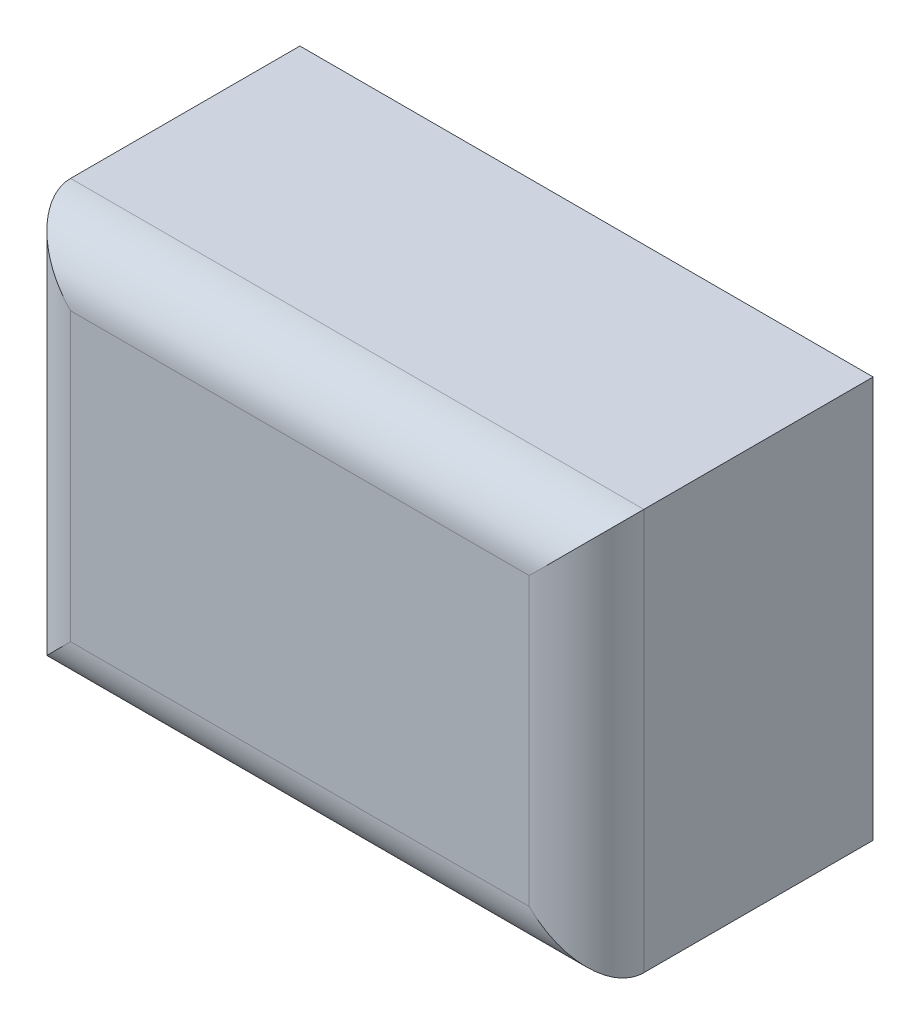
ISO-10303-21;
HEADER;
FILE_DESCRIPTION(('STEP AP214'),'2;1');
FILE_NAME('part.step','',(''),(''),'','','');
FILE_SCHEMA(('AUTOMOTIVE_DESIGN { 1 0 10303 214 1 1 1 1 }'));
ENDSEC;
DATA;
#1=APPLICATION_CONTEXT('core data for automotive mechanical design processes');
#2=APPLICATION_PROTOCOL_DEFINITION('international standard','automotive_design',2000,#1);
#3=PRODUCT_CONTEXT('',#1,'mechanical');
#4=PRODUCT('Part','Part','',(#3));
#5=PRODUCT_RELATED_PRODUCT_CATEGORY('part','',(#4));
#6=PRODUCT_DEFINITION_FORMATION('','',#4);
#7=PRODUCT_DEFINITION_CONTEXT('part definition',#1,'design');
#8=PRODUCT_DEFINITION('design','',#6,#7);
#9=PRODUCT_DEFINITION_SHAPE('','',#8);
#10=(LENGTH_UNIT() NAMED_UNIT(*) SI_UNIT(.MILLI.,.METRE.));
#11=(NAMED_UNIT(*) PLANE_ANGLE_UNIT() SI_UNIT($,.RADIAN.));
#12=(NAMED_UNIT(*) SI_UNIT($,.STERADIAN.) SOLID_ANGLE_UNIT());
#13=UNCERTAINTY_MEASURE_WITH_UNIT(LENGTH_MEASURE(1.E-05),#10,'distance_accuracy_value','');
#14=(GEOMETRIC_REPRESENTATION_CONTEXT(3) GLOBAL_UNCERTAINTY_ASSIGNED_CONTEXT((#13)) GLOBAL_UNIT_ASSIGNED_CONTEXT((#10,
#11,#12)) REPRESENTATION_CONTEXT('',''));
#15=CARTESIAN_POINT('',(0.,0.,0.));
#16=DIRECTION('',(0.,0.,1.));
#17=DIRECTION('',(1.,0.,0.));
#18=AXIS2_PLACEMENT_3D('',#15,#16,#17);
#19=CARTESIAN_POINT('',(0.,0.125,0.2));
#20=DIRECTION('',(1.,0.,0.));
#21=DIRECTION('',(0.,0.,-1.));
#22=AXIS2_PLACEMENT_3D('',#19,#20,#21);
#23=CYLINDRICAL_SURFACE('',#22,0.05);
#24=CARTESIAN_POINT('',(0.2,0.125,0.25));
#25=CARTESIAN_POINT('',(0.229289321881,0.154289321881,0.25));
#26=CARTESIAN_POINT('',(0.25,0.175,0.229289321881));
#27=CARTESIAN_POINT('',(0.25,0.175,0.2));
#28=(BOUNDED_CURVE() B_SPLINE_CURVE(3,(#24,#25,#26,#27),.UNSPECIFIED.,.F.,
.F.) B_SPLINE_CURVE_WITH_KNOTS((4,4),(1.570796326795,3.14159265359),
.UNSPECIFIED.) CURVE() GEOMETRIC_REPRESENTATION_ITEM() RATIONAL_B_SPLINE_CURVE((1.,
0.804737854124,0.804737854124,1.)) REPRESENTATION_ITEM(''));
#29=CARTESIAN_POINT('',(0.2,0.125,0.25));
#30=VERTEX_POINT('',#29);
#31=CARTESIAN_POINT('',(0.25,0.175,0.2));
#32=VERTEX_POINT('',#31);
#33=EDGE_CURVE('E28',#30,#32,#28,.T.);
#34=ORIENTED_EDGE('',*,*,#33,.T.);
#35=DIRECTION('',(1.,0.,0.));
#36=VECTOR('',#35,1.);
#37=CARTESIAN_POINT('',(0.25,0.175,0.2));
#38=LINE('',#37,#36);
#39=CARTESIAN_POINT('',(-0.25,0.175,0.2));
#40=VERTEX_POINT('',#39);
#41=EDGE_CURVE('E133',#40,#32,#38,.T.);
#42=ORIENTED_EDGE('',*,*,#41,.F.);
#43=CARTESIAN_POINT('',(-0.25,0.175,0.2));
#44=CARTESIAN_POINT('',(-0.25,0.175,0.229289321881));
#45=CARTESIAN_POINT('',(-0.229289321881,0.154289321881,0.25));
#46=CARTESIAN_POINT('',(-0.2,0.125,0.25));
#47=(BOUNDED_CURVE() B_SPLINE_CURVE(3,(#43,#44,#45,#46),.UNSPECIFIED.,.F.,
.F.) B_SPLINE_CURVE_WITH_KNOTS((4,4),(0.,1.570796326795),
.UNSPECIFIED.) CURVE() GEOMETRIC_REPRESENTATION_ITEM() RATIONAL_B_SPLINE_CURVE((1.,
0.804737854124,0.804737854124,1.)) REPRESENTATION_ITEM(''));
#48=CARTESIAN_POINT('',(-0.2,0.125,0.25));
#49=VERTEX_POINT('',#48);
#50=EDGE_CURVE('E11',#40,#49,#47,.T.);
#51=ORIENTED_EDGE('',*,*,#50,.T.);
#52=DIRECTION('',(-1.,0.,0.));
#53=VECTOR('',#52,1.);
#54=CARTESIAN_POINT('',(-0.25,0.125,0.25));
#55=LINE('',#54,#53);
#56=EDGE_CURVE('E141',#30,#49,#55,.T.);
#57=ORIENTED_EDGE('',*,*,#56,.F.);
#58=EDGE_LOOP('',(#34,#42,#51,#57));
#59=FACE_BOUND('',#58,.T.);
#60=ADVANCED_FACE('F17',(#59),#23,.T.);
#61=CARTESIAN_POINT('',(-0.2,0.,0.2));
#62=DIRECTION('',(0.,1.,0.));
#63=DIRECTION('',(0.,0.,1.));
#64=AXIS2_PLACEMENT_3D('',#61,#62,#63);
#65=CYLINDRICAL_SURFACE('',#64,0.05);
#66=CARTESIAN_POINT('',(-0.25,-0.175,0.2));
#67=CARTESIAN_POINT('',(-0.25,-0.175,0.229289321881));
#68=CARTESIAN_POINT('',(-0.229289321881,-0.154289321881,0.25));
#69=CARTESIAN_POINT('',(-0.2,-0.125,0.25));
#70=(BOUNDED_CURVE() B_SPLINE_CURVE(3,(#66,#67,#68,#69),.UNSPECIFIED.,.F.,
.F.) B_SPLINE_CURVE_WITH_KNOTS((4,4),(3.14159265359,4.712388980385),
.UNSPECIFIED.) CURVE() GEOMETRIC_REPRESENTATION_ITEM() RATIONAL_B_SPLINE_CURVE((1.,
0.804737854124,0.804737854124,1.)) REPRESENTATION_ITEM(''));
#71=CARTESIAN_POINT('',(-0.25,-0.175,0.2));
#72=VERTEX_POINT('',#71);
#73=CARTESIAN_POINT('',(-0.2,-0.125,0.25));
#74=VERTEX_POINT('',#73);
#75=EDGE_CURVE('E42',#72,#74,#70,.T.);
#76=ORIENTED_EDGE('',*,*,#75,.T.);
#77=DIRECTION('',(0.,-1.,0.));
#78=VECTOR('',#77,1.);
#79=CARTESIAN_POINT('',(-0.2,-0.175,0.25));
#80=LINE('',#79,#78);
#81=EDGE_CURVE('E155',#49,#74,#80,.T.);
#82=ORIENTED_EDGE('',*,*,#81,.F.);
#83=ORIENTED_EDGE('',*,*,#50,.F.);
#84=DIRECTION('',(0.,1.,0.));
#85=VECTOR('',#84,1.);
#86=CARTESIAN_POINT('',(-0.25,0.175,0.2));
#87=LINE('',#86,#85);
#88=EDGE_CURVE('E117',#72,#40,#87,.T.);
#89=ORIENTED_EDGE('',*,*,#88,.F.);
#90=EDGE_LOOP('',(#76,#82,#83,#89));
#91=FACE_BOUND('',#90,.T.);
#92=ADVANCED_FACE('F268',(#91),#65,.T.);
#93=CARTESIAN_POINT('',(0.2,0.,0.2));
#94=DIRECTION('',(0.,-1.,0.));
#95=DIRECTION('',(0.,0.,-1.));
#96=AXIS2_PLACEMENT_3D('',#93,#94,#95);
#97=CYLINDRICAL_SURFACE('',#96,0.05);
#98=CARTESIAN_POINT('',(0.2,-0.125,0.25));
#99=CARTESIAN_POINT('',(0.229289321881,-0.154289321881,0.25));
#100=CARTESIAN_POINT('',(0.25,-0.175,0.229289321881));
#101=CARTESIAN_POINT('',(0.25,-0.175,0.2));
#102=(BOUNDED_CURVE() B_SPLINE_CURVE(3,(#98,#99,#100,#101),.UNSPECIFIED.,.F.,
.F.) B_SPLINE_CURVE_WITH_KNOTS((4,4),(1.570796326795,3.14159265359),
.UNSPECIFIED.) CURVE() GEOMETRIC_REPRESENTATION_ITEM() RATIONAL_B_SPLINE_CURVE((1.,
0.804737854124,0.804737854124,1.)) REPRESENTATION_ITEM(''));
#103=CARTESIAN_POINT('',(0.2,-0.125,0.25));
#104=VERTEX_POINT('',#103);
#105=CARTESIAN_POINT('',(0.25,-0.175,0.2));
#106=VERTEX_POINT('',#105);
#107=EDGE_CURVE('E125',#104,#106,#102,.T.);
#108=ORIENTED_EDGE('',*,*,#107,.T.);
#109=DIRECTION('',(0.,-1.,0.));
#110=VECTOR('',#109,1.);
#111=CARTESIAN_POINT('',(0.25,-0.175,0.2));
#112=LINE('',#111,#110);
#113=EDGE_CURVE('E148',#32,#106,#112,.T.);
#114=ORIENTED_EDGE('',*,*,#113,.F.);
#115=ORIENTED_EDGE('',*,*,#33,.F.);
#116=DIRECTION('',(0.,1.,0.));
#117=VECTOR('',#116,1.);
#118=CARTESIAN_POINT('',(0.2,0.175,0.25));
#119=LINE('',#118,#117);
#120=EDGE_CURVE('E132',#104,#30,#119,.T.);
#121=ORIENTED_EDGE('',*,*,#120,.F.);
#122=EDGE_LOOP('',(#108,#114,#115,#121));
#123=FACE_BOUND('',#122,.T.);
#124=ADVANCED_FACE('F263',(#123),#97,.T.);
#125=CARTESIAN_POINT('',(0.,-0.125,0.2));
#126=DIRECTION('',(-1.,0.,0.));
#127=DIRECTION('',(0.,0.,1.));
#128=AXIS2_PLACEMENT_3D('',#125,#126,#127);
#129=CYLINDRICAL_SURFACE('',#128,0.05);
#130=ORIENTED_EDGE('',*,*,#75,.F.);
#131=DIRECTION('',(-1.,0.,0.));
#132=VECTOR('',#131,1.);
#133=CARTESIAN_POINT('',(-0.25,-0.175,0.2));
#134=LINE('',#133,#132);
#135=EDGE_CURVE('E104',#106,#72,#134,.T.);
#136=ORIENTED_EDGE('',*,*,#135,.F.);
#137=ORIENTED_EDGE('',*,*,#107,.F.);
#138=DIRECTION('',(1.,0.,0.));
#139=VECTOR('',#138,1.);
#140=CARTESIAN_POINT('',(0.25,-0.125,0.25));
#141=LINE('',#140,#139);
#142=EDGE_CURVE('E152',#74,#104,#141,.T.);
#143=ORIENTED_EDGE('',*,*,#142,.F.);
#144=EDGE_LOOP('',(#130,#136,#137,#143));
#145=FACE_BOUND('',#144,.T.);
#146=ADVANCED_FACE('F242',(#145),#129,.T.);
#147=CARTESIAN_POINT('',(0.,0.,0.));
#148=DIRECTION('',(0.,0.,1.));
#149=DIRECTION('',(1.,0.,0.));
#150=AXIS2_PLACEMENT_3D('',#147,#148,#149);
#151=PLANE('',#150);
#152=DIRECTION('',(0.,-1.,0.));
#153=VECTOR('',#152,1.);
#154=CARTESIAN_POINT('',(-0.25,0.175,0.));
#155=LINE('',#154,#153);
#156=CARTESIAN_POINT('',(-0.25,0.175,0.));
#157=VERTEX_POINT('',#156);
#158=CARTESIAN_POINT('',(-0.25,-0.175,0.));
#159=VERTEX_POINT('',#158);
#160=EDGE_CURVE('E96',#157,#159,#155,.T.);
#161=ORIENTED_EDGE('',*,*,#160,.F.);
#162=DIRECTION('',(-1.,0.,0.));
#163=VECTOR('',#162,1.);
#164=CARTESIAN_POINT('',(-0.25,0.175,0.));
#165=LINE('',#164,#163);
#166=CARTESIAN_POINT('',(0.25,0.175,0.));
#167=VERTEX_POINT('',#166);
#168=EDGE_CURVE('E129',#167,#157,#165,.T.);
#169=ORIENTED_EDGE('',*,*,#168,.F.);
#170=DIRECTION('',(0.,1.,0.));
#171=VECTOR('',#170,1.);
#172=CARTESIAN_POINT('',(0.25,0.175,0.));
#173=LINE('',#172,#171);
#174=CARTESIAN_POINT('',(0.25,-0.175,0.));
#175=VERTEX_POINT('',#174);
#176=EDGE_CURVE('E69',#175,#167,#173,.T.);
#177=ORIENTED_EDGE('',*,*,#176,.F.);
#178=DIRECTION('',(1.,0.,0.));
#179=VECTOR('',#178,1.);
#180=CARTESIAN_POINT('',(-0.25,-0.175,0.));
#181=LINE('',#180,#179);
#182=EDGE_CURVE('E21',#159,#175,#181,.T.);
#183=ORIENTED_EDGE('',*,*,#182,.F.);
#184=EDGE_LOOP('',(#161,#169,#177,#183));
#185=FACE_BOUND('',#184,.T.);
#186=ADVANCED_FACE('F95',(#185),#151,.F.);
#187=CARTESIAN_POINT('',(0.,0.,0.25));
#188=DIRECTION('',(0.,0.,1.));
#189=DIRECTION('',(1.,0.,0.));
#190=AXIS2_PLACEMENT_3D('',#187,#188,#189);
#191=PLANE('',#190);
#192=ORIENTED_EDGE('',*,*,#120,.T.);
#193=ORIENTED_EDGE('',*,*,#56,.T.);
#194=ORIENTED_EDGE('',*,*,#81,.T.);
#195=ORIENTED_EDGE('',*,*,#142,.T.);
#196=EDGE_LOOP('',(#192,#193,#194,#195));
#197=FACE_BOUND('',#196,.T.);
#198=ADVANCED_FACE('F241',(#197),#191,.T.);
#199=CARTESIAN_POINT('',(-0.25,0.175,0.25));
#200=DIRECTION('',(0.,-1.,0.));
#201=DIRECTION('',(0.,0.,-1.));
#202=AXIS2_PLACEMENT_3D('',#199,#200,#201);
#203=PLANE('',#202);
#204=DIRECTION('',(0.,0.,-1.));
#205=VECTOR('',#204,1.);
#206=CARTESIAN_POINT('',(-0.25,0.175,0.25));
#207=LINE('',#206,#205);
#208=EDGE_CURVE('E111',#40,#157,#207,.T.);
#209=ORIENTED_EDGE('',*,*,#208,.F.);
#210=ORIENTED_EDGE('',*,*,#41,.T.);
#211=DIRECTION('',(0.,0.,-1.));
#212=VECTOR('',#211,1.);
#213=CARTESIAN_POINT('',(0.25,0.175,0.25));
#214=LINE('',#213,#212);
#215=EDGE_CURVE('E103',#32,#167,#214,.T.);
#216=ORIENTED_EDGE('',*,*,#215,.T.);
#217=ORIENTED_EDGE('',*,*,#168,.T.);
#218=EDGE_LOOP('',(#209,#210,#216,#217));
#219=FACE_BOUND('',#218,.T.);
#220=ADVANCED_FACE('F19',(#219),#203,.F.);
#221=CARTESIAN_POINT('',(0.25,0.175,0.25));
#222=DIRECTION('',(-1.,0.,0.));
#223=DIRECTION('',(0.,0.,1.));
#224=AXIS2_PLACEMENT_3D('',#221,#222,#223);
#225=PLANE('',#224);
#226=ORIENTED_EDGE('',*,*,#215,.F.);
#227=ORIENTED_EDGE('',*,*,#113,.T.);
#228=DIRECTION('',(0.,0.,-1.));
#229=VECTOR('',#228,1.);
#230=CARTESIAN_POINT('',(0.25,-0.175,0.25));
#231=LINE('',#230,#229);
#232=EDGE_CURVE('E113',#106,#175,#231,.T.);
#233=ORIENTED_EDGE('',*,*,#232,.T.);
#234=ORIENTED_EDGE('',*,*,#176,.T.);
#235=EDGE_LOOP('',(#226,#227,#233,#234));
#236=FACE_BOUND('',#235,.T.);
#237=ADVANCED_FACE('F226',(#236),#225,.F.);
#238=CARTESIAN_POINT('',(-0.25,-0.175,0.25));
#239=DIRECTION('',(0.,1.,0.));
#240=DIRECTION('',(1.,0.,0.));
#241=AXIS2_PLACEMENT_3D('',#238,#239,#240);
#242=PLANE('',#241);
#243=ORIENTED_EDGE('',*,*,#232,.F.);
#244=ORIENTED_EDGE('',*,*,#135,.T.);
#245=DIRECTION('',(0.,0.,-1.));
#246=VECTOR('',#245,1.);
#247=CARTESIAN_POINT('',(-0.25,-0.175,0.25));
#248=LINE('',#247,#246);
#249=EDGE_CURVE('E109',#72,#159,#248,.T.);
#250=ORIENTED_EDGE('',*,*,#249,.T.);
#251=ORIENTED_EDGE('',*,*,#182,.T.);
#252=EDGE_LOOP('',(#243,#244,#250,#251));
#253=FACE_BOUND('',#252,.T.);
#254=ADVANCED_FACE('F115',(#253),#242,.F.);
#255=CARTESIAN_POINT('',(-0.25,0.175,0.25));
#256=DIRECTION('',(1.,0.,0.));
#257=DIRECTION('',(0.,1.,0.));
#258=AXIS2_PLACEMENT_3D('',#255,#256,#257);
#259=PLANE('',#258);
#260=ORIENTED_EDGE('',*,*,#249,.F.);
#261=ORIENTED_EDGE('',*,*,#88,.T.);
#262=ORIENTED_EDGE('',*,*,#208,.T.);
#263=ORIENTED_EDGE('',*,*,#160,.T.);
#264=EDGE_LOOP('',(#260,#261,#262,#263));
#265=FACE_BOUND('',#264,.T.);
#266=ADVANCED_FACE('F107',(#265),#259,.F.);
#267=CLOSED_SHELL('',(#60,#92,#124,#146,#186,#198,#220,#237,#254,#266));
#268=MANIFOLD_SOLID_BREP('B1',#267);
#269=ADVANCED_BREP_SHAPE_REPRESENTATION('',(#18,#268),#14);
#270=SHAPE_DEFINITION_REPRESENTATION(#9,#269);
ENDSEC;
END-ISO-10303-21;
